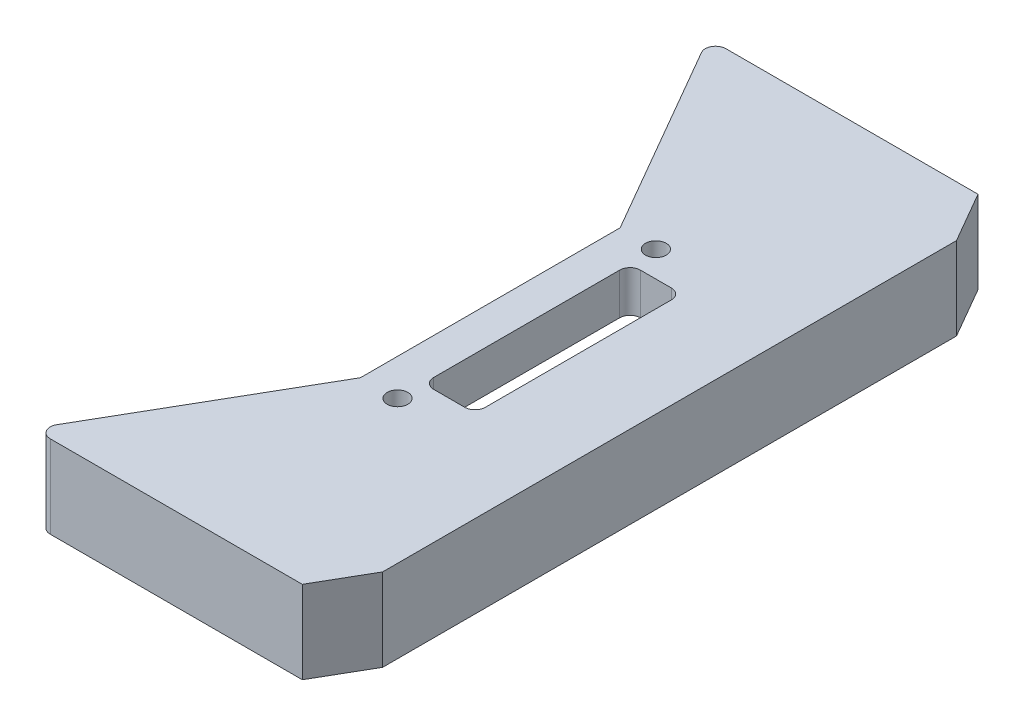
ISO-10303-21;
HEADER;
FILE_DESCRIPTION(('STEP AP214'),'2;1');
FILE_NAME('part.step','',(''),(''),'','','');
FILE_SCHEMA(('AUTOMOTIVE_DESIGN { 1 0 10303 214 1 1 1 1 }'));
ENDSEC;
DATA;
#1=APPLICATION_CONTEXT('core data for automotive mechanical design processes');
#2=APPLICATION_PROTOCOL_DEFINITION('international standard','automotive_design',2000,#1);
#3=PRODUCT_CONTEXT('',#1,'mechanical');
#4=PRODUCT('Part','Part','',(#3));
#5=PRODUCT_RELATED_PRODUCT_CATEGORY('part','',(#4));
#6=PRODUCT_DEFINITION_FORMATION('','',#4);
#7=PRODUCT_DEFINITION_CONTEXT('part definition',#1,'design');
#8=PRODUCT_DEFINITION('design','',#6,#7);
#9=PRODUCT_DEFINITION_SHAPE('','',#8);
#10=(LENGTH_UNIT() NAMED_UNIT(*) SI_UNIT(.MILLI.,.METRE.));
#11=(NAMED_UNIT(*) PLANE_ANGLE_UNIT() SI_UNIT($,.RADIAN.));
#12=(NAMED_UNIT(*) SI_UNIT($,.STERADIAN.) SOLID_ANGLE_UNIT());
#13=UNCERTAINTY_MEASURE_WITH_UNIT(LENGTH_MEASURE(1.E-05),#10,'distance_accuracy_value','');
#14=(GEOMETRIC_REPRESENTATION_CONTEXT(3) GLOBAL_UNCERTAINTY_ASSIGNED_CONTEXT((#13)) GLOBAL_UNIT_ASSIGNED_CONTEXT((#10,
#11,#12)) REPRESENTATION_CONTEXT('',''));
#15=CARTESIAN_POINT('',(0.,0.,0.));
#16=DIRECTION('',(0.,0.,1.));
#17=DIRECTION('',(1.,0.,0.));
#18=AXIS2_PLACEMENT_3D('',#15,#16,#17);
#19=CARTESIAN_POINT('',(0.,-9.,0.));
#20=DIRECTION('',(0.,1.,0.));
#21=DIRECTION('',(0.,0.,1.));
#22=AXIS2_PLACEMENT_3D('',#19,#20,#21);
#23=PLANE('',#22);
#24=DIRECTION('',(0.,0.,-1.));
#25=VECTOR('',#24,1.);
#26=CARTESIAN_POINT('',(77.3329037686546,-9.,38.));
#27=LINE('',#26,#25);
#28=CARTESIAN_POINT('',(77.3329037686546,-9.,37.));
#29=VERTEX_POINT('',#28);
#30=CARTESIAN_POINT('',(77.3329037686546,-9.,35.0669872981078));
#31=VERTEX_POINT('',#30);
#32=EDGE_CURVE('E313',#29,#31,#27,.T.);
#33=ORIENTED_EDGE('',*,*,#32,.F.);
#34=CARTESIAN_POINT('',(78.3329037686546,-9.,37.));
#35=DIRECTION('',(0.,1.,0.));
#36=DIRECTION('',(0.,0.,1.));
#37=AXIS2_PLACEMENT_3D('',#34,#35,#36);
#38=CIRCLE('',#37,1.);
#39=CARTESIAN_POINT('',(78.3329037686546,-9.,38.));
#40=VERTEX_POINT('',#39);
#41=EDGE_CURVE('E51',#29,#40,#38,.T.);
#42=ORIENTED_EDGE('',*,*,#41,.T.);
#43=DIRECTION('',(-1.,0.,0.));
#44=VECTOR('',#43,1.);
#45=CARTESIAN_POINT('',(77.3329037686546,-9.,38.));
#46=LINE('',#45,#44);
#47=CARTESIAN_POINT('',(86.8564064605509,-9.,38.));
#48=VERTEX_POINT('',#47);
#49=EDGE_CURVE('E303',#48,#40,#46,.T.);
#50=ORIENTED_EDGE('',*,*,#49,.F.);
#51=CARTESIAN_POINT('',(86.8564064605509,-9.,37.));
#52=DIRECTION('',(0.,1.,0.));
#53=DIRECTION('',(0.,0.,1.));
#54=AXIS2_PLACEMENT_3D('',#51,#52,#53);
#55=CIRCLE('',#54,1.);
#56=CARTESIAN_POINT('',(87.8564064605509,-9.,37.));
#57=VERTEX_POINT('',#56);
#58=EDGE_CURVE('E11',#48,#57,#55,.T.);
#59=ORIENTED_EDGE('',*,*,#58,.T.);
#60=DIRECTION('',(0.,0.,1.));
#61=VECTOR('',#60,1.);
#62=CARTESIAN_POINT('',(87.8564064605509,-9.,38.));
#63=LINE('',#62,#61);
#64=CARTESIAN_POINT('',(87.8564064605509,-9.,8.));
#65=VERTEX_POINT('',#64);
#66=EDGE_CURVE('E318',#65,#57,#63,.T.);
#67=ORIENTED_EDGE('',*,*,#66,.F.);
#68=CARTESIAN_POINT('',(86.8564064605509,-9.,8.));
#69=DIRECTION('',(0.,1.,0.));
#70=DIRECTION('',(0.,0.,1.));
#71=AXIS2_PLACEMENT_3D('',#68,#69,#70);
#72=CIRCLE('',#71,1.);
#73=CARTESIAN_POINT('',(86.8564064605509,-9.,7.));
#74=VERTEX_POINT('',#73);
#75=EDGE_CURVE('E510',#65,#74,#72,.T.);
#76=ORIENTED_EDGE('',*,*,#75,.T.);
#77=DIRECTION('',(1.,0.,0.));
#78=VECTOR('',#77,1.);
#79=CARTESIAN_POINT('',(77.3329037686546,-9.,7.));
#80=LINE('',#79,#78);
#81=CARTESIAN_POINT('',(78.3329037686546,-9.,7.));
#82=VERTEX_POINT('',#81);
#83=EDGE_CURVE('E315',#82,#74,#80,.T.);
#84=ORIENTED_EDGE('',*,*,#83,.F.);
#85=CARTESIAN_POINT('',(78.3329037686546,-9.,8.));
#86=DIRECTION('',(0.,1.,0.));
#87=DIRECTION('',(0.,0.,1.));
#88=AXIS2_PLACEMENT_3D('',#85,#86,#87);
#89=CIRCLE('',#88,1.);
#90=CARTESIAN_POINT('',(77.3329037686546,-9.,8.));
#91=VERTEX_POINT('',#90);
#92=EDGE_CURVE('E512',#82,#91,#89,.T.);
#93=ORIENTED_EDGE('',*,*,#92,.T.);
#94=CARTESIAN_POINT('',(77.3329037686546,-9.,9.93301270189214));
#95=VERTEX_POINT('',#94);
#96=EDGE_CURVE('E298',#95,#91,#27,.T.);
#97=ORIENTED_EDGE('',*,*,#96,.F.);
#98=DIRECTION('',(-0.5,0.,-0.866025403784439));
#99=VECTOR('',#98,1.);
#100=CARTESIAN_POINT('',(77.3329037686546,-9.,9.93301270189214));
#101=LINE('',#100,#99);
#102=CARTESIAN_POINT('',(66.8663373999927,-9.,-8.19561202942197));
#103=VERTEX_POINT('',#102);
#104=EDGE_CURVE('E410',#95,#103,#101,.T.);
#105=ORIENTED_EDGE('',*,*,#104,.T.);
#106=DIRECTION('',(-1.,0.,0.));
#107=VECTOR('',#106,1.);
#108=CARTESIAN_POINT('',(66.8663373999927,-9.,-8.19561202942197));
#109=LINE('',#108,#107);
#110=CARTESIAN_POINT('',(90.6820360040645,-9.,-8.19561202942197));
#111=VERTEX_POINT('',#110);
#112=EDGE_CURVE('E326',#111,#103,#109,.T.);
#113=ORIENTED_EDGE('',*,*,#112,.F.);
#114=DIRECTION('',(-0.499999999999996,0.,-0.866025403784441));
#115=VECTOR('',#114,1.);
#116=CARTESIAN_POINT('',(90.6820360040645,-9.,-8.19561202942197));
#117=LINE('',#116,#115);
#118=CARTESIAN_POINT('',(92.6817240078563,-9.,-4.73205080756865));
#119=VERTEX_POINT('',#118);
#120=EDGE_CURVE('E368',#119,#111,#117,.T.);
#121=ORIENTED_EDGE('',*,*,#120,.F.);
#122=DIRECTION('',(0.,0.,-1.));
#123=VECTOR('',#122,1.);
#124=CARTESIAN_POINT('',(92.6817240078563,-9.,-4.73205080756865));
#125=LINE('',#124,#123);
#126=CARTESIAN_POINT('',(92.6817240078563,-9.,49.7320508075686));
#127=VERTEX_POINT('',#126);
#128=EDGE_CURVE('E365',#127,#119,#125,.T.);
#129=ORIENTED_EDGE('',*,*,#128,.F.);
#130=DIRECTION('',(0.500000000000001,0.,-0.866025403784438));
#131=VECTOR('',#130,1.);
#132=CARTESIAN_POINT('',(92.6817240078563,-9.,49.7320508075686));
#133=LINE('',#132,#131);
#134=CARTESIAN_POINT('',(90.6820360040645,-9.,53.1956120294219));
#135=VERTEX_POINT('',#134);
#136=EDGE_CURVE('E362',#135,#127,#133,.T.);
#137=ORIENTED_EDGE('',*,*,#136,.F.);
#138=DIRECTION('',(1.,0.,0.));
#139=VECTOR('',#138,1.);
#140=CARTESIAN_POINT('',(90.6820360040645,-9.,53.1956120294219));
#141=LINE('',#140,#139);
#142=CARTESIAN_POINT('',(66.8663373999927,-9.,53.1956120294219));
#143=VERTEX_POINT('',#142);
#144=EDGE_CURVE('E312',#143,#135,#141,.T.);
#145=ORIENTED_EDGE('',*,*,#144,.F.);
#146=DIRECTION('',(0.5,0.,-0.866025403784439));
#147=VECTOR('',#146,1.);
#148=CARTESIAN_POINT('',(77.3329037686546,-9.,35.0669872981078));
#149=LINE('',#148,#147);
#150=EDGE_CURVE('E407',#143,#31,#149,.T.);
#151=ORIENTED_EDGE('',*,*,#150,.T.);
#152=EDGE_LOOP('',(#33,#42,#50,#59,#67,#76,#84,#93,#97,#105,#113,#121,#129,#137,#145,#151));
#153=FACE_BOUND('',#152,.T.);
#154=ADVANCED_FACE('F43',(#153),#23,.F.);
#155=CARTESIAN_POINT('',(0.,-7.,0.));
#156=DIRECTION('',(0.,1.,0.));
#157=DIRECTION('',(0.,0.,1.));
#158=AXIS2_PLACEMENT_3D('',#155,#156,#157);
#159=PLANE('',#158);
#160=CARTESIAN_POINT('',(80.8564064605509,-7.,10.));
#161=DIRECTION('',(0.,-1.,0.));
#162=DIRECTION('',(0.,0.,-1.));
#163=AXIS2_PLACEMENT_3D('',#160,#161,#162);
#164=CIRCLE('',#163,0.999999999999998);
#165=CARTESIAN_POINT('',(80.8564064605509,-7.,9.));
#166=VERTEX_POINT('',#165);
#167=EDGE_CURVE('E403',#166,#166,#164,.T.);
#168=ORIENTED_EDGE('',*,*,#167,.T.);
#169=EDGE_LOOP('',(#168));
#170=FACE_BOUND('',#169,.T.);
#171=DIRECTION('',(0.5,0.,-0.866025403784439));
#172=VECTOR('',#171,1.);
#173=CARTESIAN_POINT('',(77.3329037686546,-7.,35.0669872981078));
#174=LINE('',#173,#172);
#175=CARTESIAN_POINT('',(66.5776622653979,-7.,53.6956120294219));
#176=VERTEX_POINT('',#175);
#177=CARTESIAN_POINT('',(77.3329037686546,-7.,35.0669872981078));
#178=VERTEX_POINT('',#177);
#179=EDGE_CURVE('E423',#176,#178,#174,.T.);
#180=ORIENTED_EDGE('',*,*,#179,.F.);
#181=CARTESIAN_POINT('',(67.4436876691824,-7.,54.1956120294219));
#182=DIRECTION('',(0.,1.,0.));
#183=DIRECTION('',(0.,0.,1.));
#184=AXIS2_PLACEMENT_3D('',#181,#182,#183);
#185=CIRCLE('',#184,1.);
#186=CARTESIAN_POINT('',(67.4436876691824,-7.,55.1956120294219));
#187=VERTEX_POINT('',#186);
#188=EDGE_CURVE('E453',#176,#187,#185,.T.);
#189=ORIENTED_EDGE('',*,*,#188,.T.);
#190=DIRECTION('',(-1.,0.,0.));
#191=VECTOR('',#190,1.);
#192=CARTESIAN_POINT('',(65.7116368616135,-7.,55.1956120294219));
#193=LINE('',#192,#191);
#194=CARTESIAN_POINT('',(91.8367365424438,-7.,55.1956120294219));
#195=VERTEX_POINT('',#194);
#196=EDGE_CURVE('E420',#195,#187,#193,.T.);
#197=ORIENTED_EDGE('',*,*,#196,.F.);
#198=DIRECTION('',(-0.5,0.,0.866025403784439));
#199=VECTOR('',#198,1.);
#200=CARTESIAN_POINT('',(91.8367365424438,-7.,55.1956120294219));
#201=LINE('',#200,#199);
#202=CARTESIAN_POINT('',(94.6817240078563,-7.,50.2679491924309));
#203=VERTEX_POINT('',#202);
#204=EDGE_CURVE('E418',#203,#195,#201,.T.);
#205=ORIENTED_EDGE('',*,*,#204,.F.);
#206=DIRECTION('',(0.,0.,1.));
#207=VECTOR('',#206,1.);
#208=CARTESIAN_POINT('',(94.6817240078563,-7.,50.2679491924309));
#209=LINE('',#208,#207);
#210=CARTESIAN_POINT('',(94.6817240078563,-7.,-5.26794919243089));
#211=VERTEX_POINT('',#210);
#212=EDGE_CURVE('E416',#211,#203,#209,.T.);
#213=ORIENTED_EDGE('',*,*,#212,.F.);
#214=DIRECTION('',(0.499999999999997,0.,0.86602540378444));
#215=VECTOR('',#214,1.);
#216=CARTESIAN_POINT('',(91.8367365424438,-7.,-10.195612029422));
#217=LINE('',#216,#215);
#218=CARTESIAN_POINT('',(91.8367365424438,-7.,-10.195612029422));
#219=VERTEX_POINT('',#218);
#220=EDGE_CURVE('E406',#219,#211,#217,.T.);
#221=ORIENTED_EDGE('',*,*,#220,.F.);
#222=DIRECTION('',(1.,0.,0.));
#223=VECTOR('',#222,1.);
#224=CARTESIAN_POINT('',(65.7116368616135,-7.,-10.195612029422));
#225=LINE('',#224,#223);
#226=CARTESIAN_POINT('',(67.4436876691824,-7.,-10.195612029422));
#227=VERTEX_POINT('',#226);
#228=EDGE_CURVE('E411',#227,#219,#225,.T.);
#229=ORIENTED_EDGE('',*,*,#228,.F.);
#230=CARTESIAN_POINT('',(67.4436876691824,-7.,-9.19561202942197));
#231=DIRECTION('',(0.,1.,0.));
#232=DIRECTION('',(0.,0.,1.));
#233=AXIS2_PLACEMENT_3D('',#230,#231,#232);
#234=CIRCLE('',#233,1.);
#235=CARTESIAN_POINT('',(66.5776622653979,-7.,-8.69561202942197));
#236=VERTEX_POINT('',#235);
#237=EDGE_CURVE('E451',#227,#236,#234,.T.);
#238=ORIENTED_EDGE('',*,*,#237,.T.);
#239=DIRECTION('',(-0.5,0.,-0.866025403784439));
#240=VECTOR('',#239,1.);
#241=CARTESIAN_POINT('',(77.3329037686546,-7.,9.93301270189214));
#242=LINE('',#241,#240);
#243=CARTESIAN_POINT('',(77.3329037686546,-7.,9.93301270189214));
#244=VERTEX_POINT('',#243);
#245=EDGE_CURVE('E427',#244,#236,#242,.T.);
#246=ORIENTED_EDGE('',*,*,#245,.F.);
#247=DIRECTION('',(0.,0.,-1.));
#248=VECTOR('',#247,1.);
#249=CARTESIAN_POINT('',(77.3329037686546,-7.,35.0669872981078));
#250=LINE('',#249,#248);
#251=EDGE_CURVE('E425',#178,#244,#250,.T.);
#252=ORIENTED_EDGE('',*,*,#251,.F.);
#253=EDGE_LOOP('',(#180,#189,#197,#205,#213,#221,#229,#238,#246,#252));
#254=FACE_BOUND('',#253,.T.);
#255=CARTESIAN_POINT('',(80.8564064605509,-7.,35.));
#256=DIRECTION('',(0.,-1.,0.));
#257=DIRECTION('',(0.,0.,-1.));
#258=AXIS2_PLACEMENT_3D('',#255,#256,#257);
#259=CIRCLE('',#258,0.999999999999998);
#260=CARTESIAN_POINT('',(80.8564064605509,-7.,34.));
#261=VERTEX_POINT('',#260);
#262=EDGE_CURVE('E400',#261,#261,#259,.T.);
#263=ORIENTED_EDGE('',*,*,#262,.T.);
#264=EDGE_LOOP('',(#263));
#265=FACE_BOUND('',#264,.T.);
#266=DIRECTION('',(0.,0.,1.));
#267=VECTOR('',#266,1.);
#268=CARTESIAN_POINT('',(85.8564064605509,-7.,32.5));
#269=LINE('',#268,#267);
#270=CARTESIAN_POINT('',(85.8564064605509,-7.,13.5));
#271=VERTEX_POINT('',#270);
#272=CARTESIAN_POINT('',(85.8564064605509,-7.,31.5));
#273=VERTEX_POINT('',#272);
#274=EDGE_CURVE('E394',#271,#273,#269,.T.);
#275=ORIENTED_EDGE('',*,*,#274,.T.);
#276=CARTESIAN_POINT('',(84.8564064605509,-7.,31.5));
#277=DIRECTION('',(0.,1.,0.));
#278=DIRECTION('',(0.,0.,1.));
#279=AXIS2_PLACEMENT_3D('',#276,#277,#278);
#280=CIRCLE('',#279,1.);
#281=CARTESIAN_POINT('',(84.8564064605509,-7.,32.5));
#282=VERTEX_POINT('',#281);
#283=EDGE_CURVE('E262',#273,#282,#280,.F.);
#284=ORIENTED_EDGE('',*,*,#283,.T.);
#285=DIRECTION('',(-1.,0.,0.));
#286=VECTOR('',#285,1.);
#287=CARTESIAN_POINT('',(80.8564064605509,-7.,32.5));
#288=LINE('',#287,#286);
#289=CARTESIAN_POINT('',(81.8564064605509,-7.,32.5));
#290=VERTEX_POINT('',#289);
#291=EDGE_CURVE('E397',#282,#290,#288,.T.);
#292=ORIENTED_EDGE('',*,*,#291,.T.);
#293=CARTESIAN_POINT('',(81.8564064605509,-7.,31.5));
#294=DIRECTION('',(0.,1.,0.));
#295=DIRECTION('',(0.,0.,1.));
#296=AXIS2_PLACEMENT_3D('',#293,#294,#295);
#297=CIRCLE('',#296,1.);
#298=CARTESIAN_POINT('',(80.8564064605509,-7.,31.5));
#299=VERTEX_POINT('',#298);
#300=EDGE_CURVE('E479',#290,#299,#297,.F.);
#301=ORIENTED_EDGE('',*,*,#300,.T.);
#302=DIRECTION('',(0.,0.,-1.));
#303=VECTOR('',#302,1.);
#304=CARTESIAN_POINT('',(80.8564064605509,-7.,32.5));
#305=LINE('',#304,#303);
#306=CARTESIAN_POINT('',(80.8564064605509,-7.,13.5));
#307=VERTEX_POINT('',#306);
#308=EDGE_CURVE('E260',#299,#307,#305,.T.);
#309=ORIENTED_EDGE('',*,*,#308,.T.);
#310=CARTESIAN_POINT('',(81.8564064605509,-7.,13.5));
#311=DIRECTION('',(0.,1.,0.));
#312=DIRECTION('',(0.,0.,1.));
#313=AXIS2_PLACEMENT_3D('',#310,#311,#312);
#314=CIRCLE('',#313,1.);
#315=CARTESIAN_POINT('',(81.8564064605509,-7.,12.5));
#316=VERTEX_POINT('',#315);
#317=EDGE_CURVE('E481',#307,#316,#314,.F.);
#318=ORIENTED_EDGE('',*,*,#317,.T.);
#319=DIRECTION('',(1.,0.,0.));
#320=VECTOR('',#319,1.);
#321=CARTESIAN_POINT('',(80.8564064605509,-7.,12.5));
#322=LINE('',#321,#320);
#323=CARTESIAN_POINT('',(84.8564064605509,-7.,12.5));
#324=VERTEX_POINT('',#323);
#325=EDGE_CURVE('E391',#316,#324,#322,.T.);
#326=ORIENTED_EDGE('',*,*,#325,.T.);
#327=CARTESIAN_POINT('',(84.8564064605509,-7.,13.5));
#328=DIRECTION('',(0.,1.,0.));
#329=DIRECTION('',(0.,0.,1.));
#330=AXIS2_PLACEMENT_3D('',#327,#328,#329);
#331=CIRCLE('',#330,1.);
#332=EDGE_CURVE('E477',#324,#271,#331,.F.);
#333=ORIENTED_EDGE('',*,*,#332,.T.);
#334=EDGE_LOOP('',(#275,#284,#292,#301,#309,#318,#326,#333));
#335=FACE_BOUND('',#334,.T.);
#336=ADVANCED_FACE('F556',(#170,#254,#265,#335),#159,.T.);
#337=CARTESIAN_POINT('',(91.8367365424438,-9.,-10.195612029422));
#338=DIRECTION('',(-0.86602540378444,0.,0.499999999999997));
#339=DIRECTION('',(0.499999999999997,0.,0.86602540378444));
#340=AXIS2_PLACEMENT_3D('',#337,#338,#339);
#341=PLANE('',#340);
#342=ORIENTED_EDGE('',*,*,#220,.T.);
#343=DIRECTION('',(0.,1.,0.));
#344=VECTOR('',#343,1.);
#345=CARTESIAN_POINT('',(94.6817240078563,-9.,-5.26794919243089));
#346=LINE('',#345,#344);
#347=CARTESIAN_POINT('',(94.6817240078563,-15.,-5.26794919243089));
#348=VERTEX_POINT('',#347);
#349=EDGE_CURVE('E445',#348,#211,#346,.T.);
#350=ORIENTED_EDGE('',*,*,#349,.F.);
#351=DIRECTION('',(0.499999999999997,0.,0.86602540378444));
#352=VECTOR('',#351,1.);
#353=CARTESIAN_POINT('',(91.8367365424438,-15.,-10.195612029422));
#354=LINE('',#353,#352);
#355=CARTESIAN_POINT('',(91.8367365424438,-15.,-10.195612029422));
#356=VERTEX_POINT('',#355);
#357=EDGE_CURVE('E353',#356,#348,#354,.T.);
#358=ORIENTED_EDGE('',*,*,#357,.F.);
#359=DIRECTION('',(0.,1.,0.));
#360=VECTOR('',#359,1.);
#361=CARTESIAN_POINT('',(91.8367365424438,-9.,-10.195612029422));
#362=LINE('',#361,#360);
#363=EDGE_CURVE('E413',#356,#219,#362,.T.);
#364=ORIENTED_EDGE('',*,*,#363,.T.);
#365=EDGE_LOOP('',(#342,#350,#358,#364));
#366=FACE_BOUND('',#365,.T.);
#367=ADVANCED_FACE('F574',(#366),#341,.F.);
#368=CARTESIAN_POINT('',(94.6817240078563,-9.,50.2679491924309));
#369=DIRECTION('',(-1.,0.,0.));
#370=DIRECTION('',(0.,0.,1.));
#371=AXIS2_PLACEMENT_3D('',#368,#369,#370);
#372=PLANE('',#371);
#373=ORIENTED_EDGE('',*,*,#212,.T.);
#374=DIRECTION('',(0.,1.,0.));
#375=VECTOR('',#374,1.);
#376=CARTESIAN_POINT('',(94.6817240078563,-9.,50.2679491924309));
#377=LINE('',#376,#375);
#378=CARTESIAN_POINT('',(94.6817240078563,-15.,50.2679491924309));
#379=VERTEX_POINT('',#378);
#380=EDGE_CURVE('E442',#379,#203,#377,.T.);
#381=ORIENTED_EDGE('',*,*,#380,.F.);
#382=DIRECTION('',(0.,0.,1.));
#383=VECTOR('',#382,1.);
#384=CARTESIAN_POINT('',(94.6817240078563,-15.,-5.26794919243089));
#385=LINE('',#384,#383);
#386=EDGE_CURVE('E356',#348,#379,#385,.T.);
#387=ORIENTED_EDGE('',*,*,#386,.F.);
#388=ORIENTED_EDGE('',*,*,#349,.T.);
#389=EDGE_LOOP('',(#373,#381,#387,#388));
#390=FACE_BOUND('',#389,.T.);
#391=ADVANCED_FACE('F579',(#390),#372,.F.);
#392=CARTESIAN_POINT('',(91.8367365424438,-9.,55.1956120294219));
#393=DIRECTION('',(-0.866025403784439,0.,-0.5));
#394=DIRECTION('',(-0.5,0.,0.866025403784439));
#395=AXIS2_PLACEMENT_3D('',#392,#393,#394);
#396=PLANE('',#395);
#397=ORIENTED_EDGE('',*,*,#204,.T.);
#398=DIRECTION('',(0.,1.,0.));
#399=VECTOR('',#398,1.);
#400=CARTESIAN_POINT('',(91.8367365424438,-9.,55.1956120294219));
#401=LINE('',#400,#399);
#402=CARTESIAN_POINT('',(91.8367365424438,-15.,55.1956120294219));
#403=VERTEX_POINT('',#402);
#404=EDGE_CURVE('E439',#403,#195,#401,.T.);
#405=ORIENTED_EDGE('',*,*,#404,.F.);
#406=DIRECTION('',(-0.5,0.,0.866025403784439));
#407=VECTOR('',#406,1.);
#408=CARTESIAN_POINT('',(94.6817240078563,-15.,50.2679491924309));
#409=LINE('',#408,#407);
#410=EDGE_CURVE('E322',#379,#403,#409,.T.);
#411=ORIENTED_EDGE('',*,*,#410,.F.);
#412=ORIENTED_EDGE('',*,*,#380,.T.);
#413=EDGE_LOOP('',(#397,#405,#411,#412));
#414=FACE_BOUND('',#413,.T.);
#415=ADVANCED_FACE('F582',(#414),#396,.F.);
#416=CARTESIAN_POINT('',(65.7116368616135,-9.,55.1956120294219));
#417=DIRECTION('',(0.,0.,-1.));
#418=DIRECTION('',(-1.,0.,0.));
#419=AXIS2_PLACEMENT_3D('',#416,#417,#418);
#420=PLANE('',#419);
#421=ORIENTED_EDGE('',*,*,#196,.T.);
#422=DIRECTION('',(0.,1.,0.));
#423=VECTOR('',#422,1.);
#424=CARTESIAN_POINT('',(67.4436876691824,-9.,55.1956120294219));
#425=LINE('',#424,#423);
#426=CARTESIAN_POINT('',(67.4436876691824,-15.,55.1956120294219));
#427=VERTEX_POINT('',#426);
#428=EDGE_CURVE('E455',#187,#427,#425,.F.);
#429=ORIENTED_EDGE('',*,*,#428,.T.);
#430=DIRECTION('',(-1.,0.,0.));
#431=VECTOR('',#430,1.);
#432=CARTESIAN_POINT('',(91.8367365424438,-15.,55.1956120294219));
#433=LINE('',#432,#431);
#434=EDGE_CURVE('E325',#403,#427,#433,.T.);
#435=ORIENTED_EDGE('',*,*,#434,.F.);
#436=ORIENTED_EDGE('',*,*,#404,.T.);
#437=EDGE_LOOP('',(#421,#429,#435,#436));
#438=FACE_BOUND('',#437,.T.);
#439=ADVANCED_FACE('F585',(#438),#420,.F.);
#440=CARTESIAN_POINT('',(77.3329037686546,-9.,35.0669872981078));
#441=DIRECTION('',(0.866025403784439,0.,0.5));
#442=DIRECTION('',(0.5,0.,-0.866025403784439));
#443=AXIS2_PLACEMENT_3D('',#440,#441,#442);
#444=PLANE('',#443);
#445=ORIENTED_EDGE('',*,*,#150,.F.);
#446=DIRECTION('',(0.,1.,0.));
#447=VECTOR('',#446,1.);
#448=CARTESIAN_POINT('',(66.8663373999927,-15.,53.1956120294219));
#449=LINE('',#448,#447);
#450=CARTESIAN_POINT('',(66.8663373999927,-15.,53.1956120294219));
#451=VERTEX_POINT('',#450);
#452=EDGE_CURVE('E387',#451,#143,#449,.T.);
#453=ORIENTED_EDGE('',*,*,#452,.F.);
#454=DIRECTION('',(0.499999999999996,0.,-0.866025403784441));
#455=VECTOR('',#454,1.);
#456=CARTESIAN_POINT('',(66.5776622653979,-15.,53.6956120294219));
#457=LINE('',#456,#455);
#458=CARTESIAN_POINT('',(66.5776622653979,-15.,53.6956120294219));
#459=VERTEX_POINT('',#458);
#460=EDGE_CURVE('E332',#459,#451,#457,.T.);
#461=ORIENTED_EDGE('',*,*,#460,.F.);
#462=DIRECTION('',(0.,1.,0.));
#463=VECTOR('',#462,1.);
#464=CARTESIAN_POINT('',(66.5776622653979,-9.,53.6956120294219));
#465=LINE('',#464,#463);
#466=EDGE_CURVE('E448',#459,#176,#465,.T.);
#467=ORIENTED_EDGE('',*,*,#466,.T.);
#468=ORIENTED_EDGE('',*,*,#179,.T.);
#469=DIRECTION('',(0.,1.,0.));
#470=VECTOR('',#469,1.);
#471=CARTESIAN_POINT('',(77.3329037686546,-9.,35.0669872981078));
#472=LINE('',#471,#470);
#473=EDGE_CURVE('E436',#31,#178,#472,.T.);
#474=ORIENTED_EDGE('',*,*,#473,.F.);
#475=EDGE_LOOP('',(#445,#453,#461,#467,#468,#474));
#476=FACE_BOUND('',#475,.T.);
#477=ADVANCED_FACE('F551',(#476),#444,.F.);
#478=CARTESIAN_POINT('',(77.3329037686546,-9.,35.0669872981078));
#479=DIRECTION('',(1.,0.,0.));
#480=DIRECTION('',(0.,0.,-1.));
#481=AXIS2_PLACEMENT_3D('',#478,#479,#480);
#482=PLANE('',#481);
#483=ORIENTED_EDGE('',*,*,#96,.T.);
#484=DIRECTION('',(0.,1.,0.));
#485=VECTOR('',#484,1.);
#486=CARTESIAN_POINT('',(77.3329037686546,-9.,8.));
#487=LINE('',#486,#485);
#488=CARTESIAN_POINT('',(77.3329037686546,-11.,8.));
#489=VERTEX_POINT('',#488);
#490=EDGE_CURVE('E504',#91,#489,#487,.F.);
#491=ORIENTED_EDGE('',*,*,#490,.T.);
#492=DIRECTION('',(0.,0.,-1.));
#493=VECTOR('',#492,1.);
#494=CARTESIAN_POINT('',(77.3329037686546,-11.,38.));
#495=LINE('',#494,#493);
#496=CARTESIAN_POINT('',(77.3329037686546,-11.,37.));
#497=VERTEX_POINT('',#496);
#498=EDGE_CURVE('E299',#497,#489,#495,.T.);
#499=ORIENTED_EDGE('',*,*,#498,.F.);
#500=DIRECTION('',(0.,1.,0.));
#501=VECTOR('',#500,1.);
#502=CARTESIAN_POINT('',(77.3329037686546,-9.,37.));
#503=LINE('',#502,#501);
#504=EDGE_CURVE('E501',#497,#29,#503,.T.);
#505=ORIENTED_EDGE('',*,*,#504,.T.);
#506=ORIENTED_EDGE('',*,*,#32,.T.);
#507=ORIENTED_EDGE('',*,*,#473,.T.);
#508=ORIENTED_EDGE('',*,*,#251,.T.);
#509=DIRECTION('',(0.,1.,0.));
#510=VECTOR('',#509,1.);
#511=CARTESIAN_POINT('',(77.3329037686546,-9.,9.93301270189214));
#512=LINE('',#511,#510);
#513=EDGE_CURVE('E433',#95,#244,#512,.T.);
#514=ORIENTED_EDGE('',*,*,#513,.F.);
#515=EDGE_LOOP('',(#483,#491,#499,#505,#506,#507,#508,#514));
#516=FACE_BOUND('',#515,.T.);
#517=ADVANCED_FACE('F521',(#516),#482,.F.);
#518=CARTESIAN_POINT('',(77.3329037686546,-9.,9.93301270189214));
#519=DIRECTION('',(0.866025403784439,0.,-0.5));
#520=DIRECTION('',(-0.5,0.,-0.866025403784439));
#521=AXIS2_PLACEMENT_3D('',#518,#519,#520);
#522=PLANE('',#521);
#523=ORIENTED_EDGE('',*,*,#245,.T.);
#524=DIRECTION('',(0.,1.,0.));
#525=VECTOR('',#524,1.);
#526=CARTESIAN_POINT('',(66.5776622653979,-9.,-8.69561202942197));
#527=LINE('',#526,#525);
#528=CARTESIAN_POINT('',(66.5776622653979,-15.,-8.69561202942197));
#529=VERTEX_POINT('',#528);
#530=EDGE_CURVE('E460',#236,#529,#527,.F.);
#531=ORIENTED_EDGE('',*,*,#530,.T.);
#532=DIRECTION('',(-0.500000000000015,0.,-0.86602540378443));
#533=VECTOR('',#532,1.);
#534=CARTESIAN_POINT('',(66.8663373999927,-15.,-8.19561202942197));
#535=LINE('',#534,#533);
#536=CARTESIAN_POINT('',(66.8663373999927,-15.,-8.19561202942197));
#537=VERTEX_POINT('',#536);
#538=EDGE_CURVE('E344',#537,#529,#535,.T.);
#539=ORIENTED_EDGE('',*,*,#538,.F.);
#540=DIRECTION('',(0.,1.,0.));
#541=VECTOR('',#540,1.);
#542=CARTESIAN_POINT('',(66.8663373999927,-15.,-8.19561202942197));
#543=LINE('',#542,#541);
#544=EDGE_CURVE('E359',#537,#103,#543,.T.);
#545=ORIENTED_EDGE('',*,*,#544,.T.);
#546=ORIENTED_EDGE('',*,*,#104,.F.);
#547=ORIENTED_EDGE('',*,*,#513,.T.);
#548=EDGE_LOOP('',(#523,#531,#539,#545,#546,#547));
#549=FACE_BOUND('',#548,.T.);
#550=ADVANCED_FACE('F561',(#549),#522,.F.);
#551=CARTESIAN_POINT('',(65.7116368616135,-9.,-10.195612029422));
#552=DIRECTION('',(0.,0.,1.));
#553=DIRECTION('',(1.,0.,0.));
#554=AXIS2_PLACEMENT_3D('',#551,#552,#553);
#555=PLANE('',#554);
#556=ORIENTED_EDGE('',*,*,#363,.F.);
#557=DIRECTION('',(1.,0.,0.));
#558=VECTOR('',#557,1.);
#559=CARTESIAN_POINT('',(67.4436876691824,-15.,-10.195612029422));
#560=LINE('',#559,#558);
#561=CARTESIAN_POINT('',(67.4436876691824,-15.,-10.195612029422));
#562=VERTEX_POINT('',#561);
#563=EDGE_CURVE('E350',#562,#356,#560,.T.);
#564=ORIENTED_EDGE('',*,*,#563,.F.);
#565=DIRECTION('',(0.,1.,0.));
#566=VECTOR('',#565,1.);
#567=CARTESIAN_POINT('',(67.4436876691824,-9.,-10.195612029422));
#568=LINE('',#567,#566);
#569=EDGE_CURVE('E457',#562,#227,#568,.T.);
#570=ORIENTED_EDGE('',*,*,#569,.T.);
#571=ORIENTED_EDGE('',*,*,#228,.T.);
#572=EDGE_LOOP('',(#556,#564,#570,#571));
#573=FACE_BOUND('',#572,.T.);
#574=ADVANCED_FACE('F571',(#573),#555,.F.);
#575=CARTESIAN_POINT('',(80.8564064605509,-9.,10.));
#576=DIRECTION('',(0.,1.,0.));
#577=DIRECTION('',(0.,0.,1.));
#578=AXIS2_PLACEMENT_3D('',#575,#576,#577);
#579=CYLINDRICAL_SURFACE('',#578,0.999999999999998);
#580=ORIENTED_EDGE('',*,*,#167,.F.);
#581=EDGE_LOOP('',(#580));
#582=FACE_BOUND('',#581,.T.);
#583=CARTESIAN_POINT('',(80.8564064605509,-11.,10.));
#584=DIRECTION('',(0.,-1.,0.));
#585=DIRECTION('',(0.,0.,-1.));
#586=AXIS2_PLACEMENT_3D('',#583,#584,#585);
#587=CIRCLE('',#586,0.999999999999997);
#588=CARTESIAN_POINT('',(80.8564064605509,-11.,9.));
#589=VERTEX_POINT('',#588);
#590=EDGE_CURVE('E971',#589,#589,#587,.T.);
#591=ORIENTED_EDGE('',*,*,#590,.T.);
#592=EDGE_LOOP('',(#591));
#593=FACE_BOUND('',#592,.T.);
#594=ADVANCED_FACE('F629',(#582,#593),#579,.F.);
#595=CARTESIAN_POINT('',(80.8564064605509,-9.,35.));
#596=DIRECTION('',(0.,1.,0.));
#597=DIRECTION('',(0.,0.,1.));
#598=AXIS2_PLACEMENT_3D('',#595,#596,#597);
#599=CYLINDRICAL_SURFACE('',#598,0.999999999999998);
#600=ORIENTED_EDGE('',*,*,#262,.F.);
#601=EDGE_LOOP('',(#600));
#602=FACE_BOUND('',#601,.T.);
#603=CARTESIAN_POINT('',(80.8564064605509,-11.,35.));
#604=DIRECTION('',(0.,-1.,0.));
#605=DIRECTION('',(0.,0.,-1.));
#606=AXIS2_PLACEMENT_3D('',#603,#604,#605);
#607=CIRCLE('',#606,1.);
#608=CARTESIAN_POINT('',(80.8564064605509,-11.,34.));
#609=VERTEX_POINT('',#608);
#610=EDGE_CURVE('E273',#609,#609,#607,.T.);
#611=ORIENTED_EDGE('',*,*,#610,.T.);
#612=EDGE_LOOP('',(#611));
#613=FACE_BOUND('',#612,.T.);
#614=ADVANCED_FACE('F755',(#602,#613),#599,.F.);
#615=CARTESIAN_POINT('',(80.8564064605509,-9.,32.5));
#616=DIRECTION('',(1.,0.,0.));
#617=DIRECTION('',(0.,0.,-1.));
#618=AXIS2_PLACEMENT_3D('',#615,#616,#617);
#619=PLANE('',#618);
#620=ORIENTED_EDGE('',*,*,#308,.F.);
#621=DIRECTION('',(0.,1.,0.));
#622=VECTOR('',#621,1.);
#623=CARTESIAN_POINT('',(80.8564064605509,-9.,31.5));
#624=LINE('',#623,#622);
#625=CARTESIAN_POINT('',(80.8564064605509,-11.,31.5));
#626=VERTEX_POINT('',#625);
#627=EDGE_CURVE('E252',#299,#626,#624,.F.);
#628=ORIENTED_EDGE('',*,*,#627,.T.);
#629=DIRECTION('',(0.,0.,-1.));
#630=VECTOR('',#629,1.);
#631=CARTESIAN_POINT('',(80.8564064605509,-11.,31.5));
#632=LINE('',#631,#630);
#633=CARTESIAN_POINT('',(80.8564064605509,-11.,13.5));
#634=VERTEX_POINT('',#633);
#635=EDGE_CURVE('E257',#626,#634,#632,.T.);
#636=ORIENTED_EDGE('',*,*,#635,.T.);
#637=DIRECTION('',(0.,1.,0.));
#638=VECTOR('',#637,1.);
#639=CARTESIAN_POINT('',(80.8564064605509,-7.,13.5));
#640=LINE('',#639,#638);
#641=EDGE_CURVE('E263',#634,#307,#640,.T.);
#642=ORIENTED_EDGE('',*,*,#641,.T.);
#643=EDGE_LOOP('',(#620,#628,#636,#642));
#644=FACE_BOUND('',#643,.T.);
#645=ADVANCED_FACE('F254',(#644),#619,.T.);
#646=CARTESIAN_POINT('',(80.8564064605509,-9.,12.5));
#647=DIRECTION('',(0.,0.,1.));
#648=DIRECTION('',(1.,0.,0.));
#649=AXIS2_PLACEMENT_3D('',#646,#647,#648);
#650=PLANE('',#649);
#651=DIRECTION('',(0.,1.,0.));
#652=VECTOR('',#651,1.);
#653=CARTESIAN_POINT('',(81.8564064605509,-9.,12.5));
#654=LINE('',#653,#652);
#655=CARTESIAN_POINT('',(81.8564064605509,-11.,12.5));
#656=VERTEX_POINT('',#655);
#657=EDGE_CURVE('E470',#316,#656,#654,.F.);
#658=ORIENTED_EDGE('',*,*,#657,.T.);
#659=DIRECTION('',(1.,0.,0.));
#660=VECTOR('',#659,1.);
#661=CARTESIAN_POINT('',(81.8564064605509,-11.,12.5));
#662=LINE('',#661,#660);
#663=CARTESIAN_POINT('',(84.8564064605509,-11.,12.5));
#664=VERTEX_POINT('',#663);
#665=EDGE_CURVE('E281',#656,#664,#662,.T.);
#666=ORIENTED_EDGE('',*,*,#665,.T.);
#667=DIRECTION('',(0.,1.,0.));
#668=VECTOR('',#667,1.);
#669=CARTESIAN_POINT('',(84.8564064605509,-7.,12.5));
#670=LINE('',#669,#668);
#671=EDGE_CURVE('E472',#664,#324,#670,.T.);
#672=ORIENTED_EDGE('',*,*,#671,.T.);
#673=ORIENTED_EDGE('',*,*,#325,.F.);
#674=EDGE_LOOP('',(#658,#666,#672,#673));
#675=FACE_BOUND('',#674,.T.);
#676=ADVANCED_FACE('F734',(#675),#650,.T.);
#677=CARTESIAN_POINT('',(85.8564064605509,-9.,32.5));
#678=DIRECTION('',(-1.,0.,0.));
#679=DIRECTION('',(0.,0.,1.));
#680=AXIS2_PLACEMENT_3D('',#677,#678,#679);
#681=PLANE('',#680);
#682=DIRECTION('',(0.,1.,0.));
#683=VECTOR('',#682,1.);
#684=CARTESIAN_POINT('',(85.8564064605509,-9.,13.5));
#685=LINE('',#684,#683);
#686=CARTESIAN_POINT('',(85.8564064605509,-11.,13.5));
#687=VERTEX_POINT('',#686);
#688=EDGE_CURVE('E462',#271,#687,#685,.F.);
#689=ORIENTED_EDGE('',*,*,#688,.T.);
#690=DIRECTION('',(0.,0.,1.));
#691=VECTOR('',#690,1.);
#692=CARTESIAN_POINT('',(85.8564064605509,-11.,13.5));
#693=LINE('',#692,#691);
#694=CARTESIAN_POINT('',(85.8564064605509,-11.,31.5));
#695=VERTEX_POINT('',#694);
#696=EDGE_CURVE('E290',#687,#695,#693,.T.);
#697=ORIENTED_EDGE('',*,*,#696,.T.);
#698=DIRECTION('',(0.,1.,0.));
#699=VECTOR('',#698,1.);
#700=CARTESIAN_POINT('',(85.8564064605509,-7.,31.5));
#701=LINE('',#700,#699);
#702=EDGE_CURVE('E464',#695,#273,#701,.T.);
#703=ORIENTED_EDGE('',*,*,#702,.T.);
#704=ORIENTED_EDGE('',*,*,#274,.F.);
#705=EDGE_LOOP('',(#689,#697,#703,#704));
#706=FACE_BOUND('',#705,.T.);
#707=ADVANCED_FACE('F723',(#706),#681,.T.);
#708=CARTESIAN_POINT('',(80.8564064605509,-9.,32.5));
#709=DIRECTION('',(0.,0.,-1.));
#710=DIRECTION('',(-1.,0.,0.));
#711=AXIS2_PLACEMENT_3D('',#708,#709,#710);
#712=PLANE('',#711);
#713=ORIENTED_EDGE('',*,*,#291,.F.);
#714=DIRECTION('',(0.,1.,0.));
#715=VECTOR('',#714,1.);
#716=CARTESIAN_POINT('',(84.8564064605509,-9.,32.5));
#717=LINE('',#716,#715);
#718=CARTESIAN_POINT('',(84.8564064605509,-11.,32.5));
#719=VERTEX_POINT('',#718);
#720=EDGE_CURVE('E468',#282,#719,#717,.F.);
#721=ORIENTED_EDGE('',*,*,#720,.T.);
#722=DIRECTION('',(-1.,0.,0.));
#723=VECTOR('',#722,1.);
#724=CARTESIAN_POINT('',(84.8564064605509,-11.,32.5));
#725=LINE('',#724,#723);
#726=CARTESIAN_POINT('',(81.8564064605509,-11.,32.5));
#727=VERTEX_POINT('',#726);
#728=EDGE_CURVE('E296',#719,#727,#725,.T.);
#729=ORIENTED_EDGE('',*,*,#728,.T.);
#730=DIRECTION('',(0.,1.,0.));
#731=VECTOR('',#730,1.);
#732=CARTESIAN_POINT('',(81.8564064605509,-7.,32.5));
#733=LINE('',#732,#731);
#734=EDGE_CURVE('E269',#727,#290,#733,.T.);
#735=ORIENTED_EDGE('',*,*,#734,.T.);
#736=EDGE_LOOP('',(#713,#721,#729,#735));
#737=FACE_BOUND('',#736,.T.);
#738=ADVANCED_FACE('F650',(#737),#712,.T.);
#739=CARTESIAN_POINT('',(67.4436876691824,-9.,54.1956120294219));
#740=DIRECTION('',(0.,1.,0.));
#741=DIRECTION('',(0.,0.,1.));
#742=AXIS2_PLACEMENT_3D('',#739,#740,#741);
#743=CYLINDRICAL_SURFACE('',#742,1.);
#744=ORIENTED_EDGE('',*,*,#466,.F.);
#745=CARTESIAN_POINT('',(67.4436876691824,-15.,54.1956120294219));
#746=DIRECTION('',(0.,-1.,0.));
#747=DIRECTION('',(0.,0.,-1.));
#748=AXIS2_PLACEMENT_3D('',#745,#746,#747);
#749=CIRCLE('',#748,1.);
#750=EDGE_CURVE('E329',#427,#459,#749,.T.);
#751=ORIENTED_EDGE('',*,*,#750,.F.);
#752=ORIENTED_EDGE('',*,*,#428,.F.);
#753=ORIENTED_EDGE('',*,*,#188,.F.);
#754=EDGE_LOOP('',(#744,#751,#752,#753));
#755=FACE_BOUND('',#754,.T.);
#756=ADVANCED_FACE('F590',(#755),#743,.T.);
#757=CARTESIAN_POINT('',(67.4436876691824,-9.,-9.19561202942197));
#758=DIRECTION('',(0.,1.,0.));
#759=DIRECTION('',(0.,0.,1.));
#760=AXIS2_PLACEMENT_3D('',#757,#758,#759);
#761=CYLINDRICAL_SURFACE('',#760,1.);
#762=ORIENTED_EDGE('',*,*,#569,.F.);
#763=CARTESIAN_POINT('',(67.4436876691824,-15.,-9.19561202942197));
#764=DIRECTION('',(0.,-1.,0.));
#765=DIRECTION('',(0.,0.,-1.));
#766=AXIS2_PLACEMENT_3D('',#763,#764,#765);
#767=CIRCLE('',#766,1.);
#768=EDGE_CURVE('E347',#529,#562,#767,.T.);
#769=ORIENTED_EDGE('',*,*,#768,.F.);
#770=ORIENTED_EDGE('',*,*,#530,.F.);
#771=ORIENTED_EDGE('',*,*,#237,.F.);
#772=EDGE_LOOP('',(#762,#769,#770,#771));
#773=FACE_BOUND('',#772,.T.);
#774=ADVANCED_FACE('F565',(#773),#761,.T.);
#775=CARTESIAN_POINT('',(84.8564064605509,-9.,31.5));
#776=DIRECTION('',(0.,-1.,0.));
#777=DIRECTION('',(0.,0.,-1.));
#778=AXIS2_PLACEMENT_3D('',#775,#776,#777);
#779=CYLINDRICAL_SURFACE('',#778,1.);
#780=ORIENTED_EDGE('',*,*,#702,.F.);
#781=CARTESIAN_POINT('',(84.8564064605509,-11.,31.5));
#782=DIRECTION('',(0.,-1.,0.));
#783=DIRECTION('',(0.,0.,-1.));
#784=AXIS2_PLACEMENT_3D('',#781,#782,#783);
#785=CIRCLE('',#784,1.);
#786=EDGE_CURVE('E293',#695,#719,#785,.T.);
#787=ORIENTED_EDGE('',*,*,#786,.T.);
#788=ORIENTED_EDGE('',*,*,#720,.F.);
#789=ORIENTED_EDGE('',*,*,#283,.F.);
#790=EDGE_LOOP('',(#780,#787,#788,#789));
#791=FACE_BOUND('',#790,.T.);
#792=ADVANCED_FACE('F653',(#791),#779,.F.);
#793=CARTESIAN_POINT('',(84.8564064605509,-9.,13.5));
#794=DIRECTION('',(0.,-1.,0.));
#795=DIRECTION('',(0.,0.,-1.));
#796=AXIS2_PLACEMENT_3D('',#793,#794,#795);
#797=CYLINDRICAL_SURFACE('',#796,1.);
#798=ORIENTED_EDGE('',*,*,#671,.F.);
#799=CARTESIAN_POINT('',(84.8564064605509,-11.,13.5));
#800=DIRECTION('',(0.,-1.,0.));
#801=DIRECTION('',(0.,0.,-1.));
#802=AXIS2_PLACEMENT_3D('',#799,#800,#801);
#803=CIRCLE('',#802,1.);
#804=EDGE_CURVE('E287',#664,#687,#803,.T.);
#805=ORIENTED_EDGE('',*,*,#804,.T.);
#806=ORIENTED_EDGE('',*,*,#688,.F.);
#807=ORIENTED_EDGE('',*,*,#332,.F.);
#808=EDGE_LOOP('',(#798,#805,#806,#807));
#809=FACE_BOUND('',#808,.T.);
#810=ADVANCED_FACE('F656',(#809),#797,.F.);
#811=CARTESIAN_POINT('',(81.8564064605509,-9.,31.5));
#812=DIRECTION('',(0.,-1.,0.));
#813=DIRECTION('',(0.,0.,-1.));
#814=AXIS2_PLACEMENT_3D('',#811,#812,#813);
#815=CYLINDRICAL_SURFACE('',#814,1.);
#816=ORIENTED_EDGE('',*,*,#734,.F.);
#817=CARTESIAN_POINT('',(81.8564064605509,-11.,31.5));
#818=DIRECTION('',(0.,-1.,0.));
#819=DIRECTION('',(0.,0.,-1.));
#820=AXIS2_PLACEMENT_3D('',#817,#818,#819);
#821=CIRCLE('',#820,1.);
#822=EDGE_CURVE('E266',#727,#626,#821,.T.);
#823=ORIENTED_EDGE('',*,*,#822,.T.);
#824=ORIENTED_EDGE('',*,*,#627,.F.);
#825=ORIENTED_EDGE('',*,*,#300,.F.);
#826=EDGE_LOOP('',(#816,#823,#824,#825));
#827=FACE_BOUND('',#826,.T.);
#828=ADVANCED_FACE('F267',(#827),#815,.F.);
#829=CARTESIAN_POINT('',(81.8564064605509,-9.,13.5));
#830=DIRECTION('',(0.,-1.,0.));
#831=DIRECTION('',(0.,0.,-1.));
#832=AXIS2_PLACEMENT_3D('',#829,#830,#831);
#833=CYLINDRICAL_SURFACE('',#832,1.);
#834=ORIENTED_EDGE('',*,*,#641,.F.);
#835=CARTESIAN_POINT('',(81.8564064605509,-11.,13.5));
#836=DIRECTION('',(0.,-1.,0.));
#837=DIRECTION('',(0.,0.,-1.));
#838=AXIS2_PLACEMENT_3D('',#835,#836,#837);
#839=CIRCLE('',#838,1.);
#840=EDGE_CURVE('E279',#634,#656,#839,.T.);
#841=ORIENTED_EDGE('',*,*,#840,.T.);
#842=ORIENTED_EDGE('',*,*,#657,.F.);
#843=ORIENTED_EDGE('',*,*,#317,.F.);
#844=EDGE_LOOP('',(#834,#841,#842,#843));
#845=FACE_BOUND('',#844,.T.);
#846=ADVANCED_FACE('F663',(#845),#833,.F.);
#847=CARTESIAN_POINT('',(90.6820360040645,-15.,53.1956120294219));
#848=DIRECTION('',(0.,0.,1.));
#849=DIRECTION('',(1.,0.,0.));
#850=AXIS2_PLACEMENT_3D('',#847,#848,#849);
#851=PLANE('',#850);
#852=ORIENTED_EDGE('',*,*,#144,.T.);
#853=DIRECTION('',(0.,1.,0.));
#854=VECTOR('',#853,1.);
#855=CARTESIAN_POINT('',(90.6820360040645,-15.,53.1956120294219));
#856=LINE('',#855,#854);
#857=CARTESIAN_POINT('',(90.6820360040645,-15.,53.1956120294219));
#858=VERTEX_POINT('',#857);
#859=EDGE_CURVE('E384',#858,#135,#856,.T.);
#860=ORIENTED_EDGE('',*,*,#859,.F.);
#861=DIRECTION('',(1.,0.,0.));
#862=VECTOR('',#861,1.);
#863=CARTESIAN_POINT('',(90.6820360040645,-15.,53.1956120294219));
#864=LINE('',#863,#862);
#865=EDGE_CURVE('E334',#451,#858,#864,.T.);
#866=ORIENTED_EDGE('',*,*,#865,.F.);
#867=ORIENTED_EDGE('',*,*,#452,.T.);
#868=EDGE_LOOP('',(#852,#860,#866,#867));
#869=FACE_BOUND('',#868,.T.);
#870=ADVANCED_FACE('F596',(#869),#851,.F.);
#871=CARTESIAN_POINT('',(92.6817240078563,-15.,49.7320508075686));
#872=DIRECTION('',(0.866025403784438,0.,0.500000000000001));
#873=DIRECTION('',(0.500000000000001,0.,-0.866025403784438));
#874=AXIS2_PLACEMENT_3D('',#871,#872,#873);
#875=PLANE('',#874);
#876=ORIENTED_EDGE('',*,*,#136,.T.);
#877=DIRECTION('',(0.,1.,0.));
#878=VECTOR('',#877,1.);
#879=CARTESIAN_POINT('',(92.6817240078563,-15.,49.7320508075686));
#880=LINE('',#879,#878);
#881=CARTESIAN_POINT('',(92.6817240078563,-15.,49.7320508075686));
#882=VERTEX_POINT('',#881);
#883=EDGE_CURVE('E381',#882,#127,#880,.T.);
#884=ORIENTED_EDGE('',*,*,#883,.F.);
#885=DIRECTION('',(0.500000000000001,0.,-0.866025403784438));
#886=VECTOR('',#885,1.);
#887=CARTESIAN_POINT('',(92.6817240078563,-15.,49.7320508075686));
#888=LINE('',#887,#886);
#889=EDGE_CURVE('E336',#858,#882,#888,.T.);
#890=ORIENTED_EDGE('',*,*,#889,.F.);
#891=ORIENTED_EDGE('',*,*,#859,.T.);
#892=EDGE_LOOP('',(#876,#884,#890,#891));
#893=FACE_BOUND('',#892,.T.);
#894=ADVANCED_FACE('F598',(#893),#875,.F.);
#895=CARTESIAN_POINT('',(92.6817240078563,-15.,-4.73205080756865));
#896=DIRECTION('',(1.,0.,0.));
#897=DIRECTION('',(0.,0.,-1.));
#898=AXIS2_PLACEMENT_3D('',#895,#896,#897);
#899=PLANE('',#898);
#900=ORIENTED_EDGE('',*,*,#128,.T.);
#901=DIRECTION('',(0.,1.,0.));
#902=VECTOR('',#901,1.);
#903=CARTESIAN_POINT('',(92.6817240078563,-15.,-4.73205080756865));
#904=LINE('',#903,#902);
#905=CARTESIAN_POINT('',(92.6817240078563,-15.,-4.73205080756865));
#906=VERTEX_POINT('',#905);
#907=EDGE_CURVE('E378',#906,#119,#904,.T.);
#908=ORIENTED_EDGE('',*,*,#907,.F.);
#909=DIRECTION('',(0.,0.,-1.));
#910=VECTOR('',#909,1.);
#911=CARTESIAN_POINT('',(92.6817240078563,-15.,-4.73205080756865));
#912=LINE('',#911,#910);
#913=EDGE_CURVE('E338',#882,#906,#912,.T.);
#914=ORIENTED_EDGE('',*,*,#913,.F.);
#915=ORIENTED_EDGE('',*,*,#883,.T.);
#916=EDGE_LOOP('',(#900,#908,#914,#915));
#917=FACE_BOUND('',#916,.T.);
#918=ADVANCED_FACE('F602',(#917),#899,.F.);
#919=CARTESIAN_POINT('',(90.6820360040645,-15.,-8.19561202942197));
#920=DIRECTION('',(0.866025403784441,0.,-0.499999999999996));
#921=DIRECTION('',(-0.499999999999996,0.,-0.866025403784441));
#922=AXIS2_PLACEMENT_3D('',#919,#920,#921);
#923=PLANE('',#922);
#924=ORIENTED_EDGE('',*,*,#120,.T.);
#925=DIRECTION('',(0.,1.,0.));
#926=VECTOR('',#925,1.);
#927=CARTESIAN_POINT('',(90.6820360040645,-15.,-8.19561202942197));
#928=LINE('',#927,#926);
#929=CARTESIAN_POINT('',(90.6820360040645,-15.,-8.19561202942197));
#930=VERTEX_POINT('',#929);
#931=EDGE_CURVE('E375',#930,#111,#928,.T.);
#932=ORIENTED_EDGE('',*,*,#931,.F.);
#933=DIRECTION('',(-0.499999999999996,0.,-0.866025403784441));
#934=VECTOR('',#933,1.);
#935=CARTESIAN_POINT('',(90.6820360040645,-15.,-8.19561202942197));
#936=LINE('',#935,#934);
#937=EDGE_CURVE('E340',#906,#930,#936,.T.);
#938=ORIENTED_EDGE('',*,*,#937,.F.);
#939=ORIENTED_EDGE('',*,*,#907,.T.);
#940=EDGE_LOOP('',(#924,#932,#938,#939));
#941=FACE_BOUND('',#940,.T.);
#942=ADVANCED_FACE('F608',(#941),#923,.F.);
#943=CARTESIAN_POINT('',(66.8663373999927,-15.,-8.19561202942197));
#944=DIRECTION('',(0.,0.,-1.));
#945=DIRECTION('',(-1.,0.,0.));
#946=AXIS2_PLACEMENT_3D('',#943,#944,#945);
#947=PLANE('',#946);
#948=ORIENTED_EDGE('',*,*,#112,.T.);
#949=ORIENTED_EDGE('',*,*,#544,.F.);
#950=DIRECTION('',(-1.,0.,0.));
#951=VECTOR('',#950,1.);
#952=CARTESIAN_POINT('',(66.8663373999927,-15.,-8.19561202942197));
#953=LINE('',#952,#951);
#954=EDGE_CURVE('E342',#930,#537,#953,.T.);
#955=ORIENTED_EDGE('',*,*,#954,.F.);
#956=ORIENTED_EDGE('',*,*,#931,.T.);
#957=EDGE_LOOP('',(#948,#949,#955,#956));
#958=FACE_BOUND('',#957,.T.);
#959=ADVANCED_FACE('F610',(#958),#947,.F.);
#960=CARTESIAN_POINT('',(67.4436876691824,-15.,54.1956120294219));
#961=DIRECTION('',(0.,-1.,0.));
#962=DIRECTION('',(0.,0.,-1.));
#963=AXIS2_PLACEMENT_3D('',#960,#961,#962);
#964=PLANE('',#963);
#965=ORIENTED_EDGE('',*,*,#410,.T.);
#966=ORIENTED_EDGE('',*,*,#434,.T.);
#967=ORIENTED_EDGE('',*,*,#750,.T.);
#968=ORIENTED_EDGE('',*,*,#460,.T.);
#969=ORIENTED_EDGE('',*,*,#865,.T.);
#970=ORIENTED_EDGE('',*,*,#889,.T.);
#971=ORIENTED_EDGE('',*,*,#913,.T.);
#972=ORIENTED_EDGE('',*,*,#937,.T.);
#973=ORIENTED_EDGE('',*,*,#954,.T.);
#974=ORIENTED_EDGE('',*,*,#538,.T.);
#975=ORIENTED_EDGE('',*,*,#768,.T.);
#976=ORIENTED_EDGE('',*,*,#563,.T.);
#977=ORIENTED_EDGE('',*,*,#357,.T.);
#978=ORIENTED_EDGE('',*,*,#386,.T.);
#979=EDGE_LOOP('',(#965,#966,#967,#968,#969,#970,#971,#972,#973,#974,#975,#976,#977,#978));
#980=FACE_BOUND('',#979,.T.);
#981=ADVANCED_FACE('F568',(#980),#964,.T.);
#982=CARTESIAN_POINT('',(0.,-11.,0.));
#983=DIRECTION('',(0.,-1.,0.));
#984=DIRECTION('',(0.,0.,-1.));
#985=AXIS2_PLACEMENT_3D('',#982,#983,#984);
#986=PLANE('',#985);
#987=ORIENTED_EDGE('',*,*,#610,.F.);
#988=EDGE_LOOP('',(#987));
#989=FACE_BOUND('',#988,.T.);
#990=DIRECTION('',(1.,0.,0.));
#991=VECTOR('',#990,1.);
#992=CARTESIAN_POINT('',(77.3329037686546,-11.,7.));
#993=LINE('',#992,#991);
#994=CARTESIAN_POINT('',(78.3329037686546,-11.,7.));
#995=VERTEX_POINT('',#994);
#996=CARTESIAN_POINT('',(86.8564064605509,-11.,7.));
#997=VERTEX_POINT('',#996);
#998=EDGE_CURVE('E302',#995,#997,#993,.T.);
#999=ORIENTED_EDGE('',*,*,#998,.T.);
#1000=CARTESIAN_POINT('',(86.8564064605509,-11.,8.));
#1001=DIRECTION('',(0.,-1.,0.));
#1002=DIRECTION('',(0.,0.,-1.));
#1003=AXIS2_PLACEMENT_3D('',#1000,#1001,#1002);
#1004=CIRCLE('',#1003,1.);
#1005=CARTESIAN_POINT('',(87.8564064605509,-11.,8.));
#1006=VERTEX_POINT('',#1005);
#1007=EDGE_CURVE('E499',#997,#1006,#1004,.T.);
#1008=ORIENTED_EDGE('',*,*,#1007,.T.);
#1009=DIRECTION('',(0.,0.,1.));
#1010=VECTOR('',#1009,1.);
#1011=CARTESIAN_POINT('',(87.8564064605509,-11.,38.));
#1012=LINE('',#1011,#1010);
#1013=CARTESIAN_POINT('',(87.8564064605509,-11.,37.));
#1014=VERTEX_POINT('',#1013);
#1015=EDGE_CURVE('E306',#1006,#1014,#1012,.T.);
#1016=ORIENTED_EDGE('',*,*,#1015,.T.);
#1017=CARTESIAN_POINT('',(86.8564064605509,-11.,37.));
#1018=DIRECTION('',(0.,-1.,0.));
#1019=DIRECTION('',(0.,0.,-1.));
#1020=AXIS2_PLACEMENT_3D('',#1017,#1018,#1019);
#1021=CIRCLE('',#1020,1.);
#1022=CARTESIAN_POINT('',(86.8564064605509,-11.,38.));
#1023=VERTEX_POINT('',#1022);
#1024=EDGE_CURVE('E493',#1014,#1023,#1021,.T.);
#1025=ORIENTED_EDGE('',*,*,#1024,.T.);
#1026=DIRECTION('',(-1.,0.,0.));
#1027=VECTOR('',#1026,1.);
#1028=CARTESIAN_POINT('',(77.3329037686546,-11.,38.));
#1029=LINE('',#1028,#1027);
#1030=CARTESIAN_POINT('',(78.3329037686546,-11.,38.));
#1031=VERTEX_POINT('',#1030);
#1032=EDGE_CURVE('E309',#1023,#1031,#1029,.T.);
#1033=ORIENTED_EDGE('',*,*,#1032,.T.);
#1034=CARTESIAN_POINT('',(78.3329037686546,-11.,37.));
#1035=DIRECTION('',(0.,-1.,0.));
#1036=DIRECTION('',(0.,0.,-1.));
#1037=AXIS2_PLACEMENT_3D('',#1034,#1035,#1036);
#1038=CIRCLE('',#1037,1.);
#1039=EDGE_CURVE('E495',#1031,#497,#1038,.T.);
#1040=ORIENTED_EDGE('',*,*,#1039,.T.);
#1041=ORIENTED_EDGE('',*,*,#498,.T.);
#1042=CARTESIAN_POINT('',(78.3329037686546,-11.,8.));
#1043=DIRECTION('',(0.,-1.,0.));
#1044=DIRECTION('',(0.,0.,-1.));
#1045=AXIS2_PLACEMENT_3D('',#1042,#1043,#1044);
#1046=CIRCLE('',#1045,1.);
#1047=EDGE_CURVE('E497',#489,#995,#1046,.T.);
#1048=ORIENTED_EDGE('',*,*,#1047,.T.);
#1049=EDGE_LOOP('',(#999,#1008,#1016,#1025,#1033,#1040,#1041,#1048));
#1050=FACE_BOUND('',#1049,.T.);
#1051=ORIENTED_EDGE('',*,*,#635,.F.);
#1052=ORIENTED_EDGE('',*,*,#822,.F.);
#1053=ORIENTED_EDGE('',*,*,#728,.F.);
#1054=ORIENTED_EDGE('',*,*,#786,.F.);
#1055=ORIENTED_EDGE('',*,*,#696,.F.);
#1056=ORIENTED_EDGE('',*,*,#804,.F.);
#1057=ORIENTED_EDGE('',*,*,#665,.F.);
#1058=ORIENTED_EDGE('',*,*,#840,.F.);
#1059=EDGE_LOOP('',(#1051,#1052,#1053,#1054,#1055,#1056,#1057,#1058));
#1060=FACE_BOUND('',#1059,.T.);
#1061=ORIENTED_EDGE('',*,*,#590,.F.);
#1062=EDGE_LOOP('',(#1061));
#1063=FACE_BOUND('',#1062,.T.);
#1064=ADVANCED_FACE('F275',(#989,#1050,#1060,#1063),#986,.T.);
#1065=CARTESIAN_POINT('',(77.3329037686546,-11.,7.));
#1066=DIRECTION('',(0.,0.,1.));
#1067=DIRECTION('',(1.,0.,0.));
#1068=AXIS2_PLACEMENT_3D('',#1065,#1066,#1067);
#1069=PLANE('',#1068);
#1070=ORIENTED_EDGE('',*,*,#83,.T.);
#1071=DIRECTION('',(0.,1.,0.));
#1072=VECTOR('',#1071,1.);
#1073=CARTESIAN_POINT('',(86.8564064605509,-11.,7.));
#1074=LINE('',#1073,#1072);
#1075=EDGE_CURVE('E491',#74,#997,#1074,.F.);
#1076=ORIENTED_EDGE('',*,*,#1075,.T.);
#1077=ORIENTED_EDGE('',*,*,#998,.F.);
#1078=DIRECTION('',(0.,1.,0.));
#1079=VECTOR('',#1078,1.);
#1080=CARTESIAN_POINT('',(78.3329037686546,-11.,7.));
#1081=LINE('',#1080,#1079);
#1082=EDGE_CURVE('E488',#995,#82,#1081,.T.);
#1083=ORIENTED_EDGE('',*,*,#1082,.T.);
#1084=EDGE_LOOP('',(#1070,#1076,#1077,#1083));
#1085=FACE_BOUND('',#1084,.T.);
#1086=ADVANCED_FACE('F529',(#1085),#1069,.F.);
#1087=CARTESIAN_POINT('',(87.8564064605509,-11.,38.));
#1088=DIRECTION('',(-1.,0.,0.));
#1089=DIRECTION('',(0.,0.,1.));
#1090=AXIS2_PLACEMENT_3D('',#1087,#1088,#1089);
#1091=PLANE('',#1090);
#1092=ORIENTED_EDGE('',*,*,#1015,.F.);
#1093=DIRECTION('',(0.,1.,0.));
#1094=VECTOR('',#1093,1.);
#1095=CARTESIAN_POINT('',(87.8564064605509,-11.,8.));
#1096=LINE('',#1095,#1094);
#1097=EDGE_CURVE('E485',#1006,#65,#1096,.T.);
#1098=ORIENTED_EDGE('',*,*,#1097,.T.);
#1099=ORIENTED_EDGE('',*,*,#66,.T.);
#1100=DIRECTION('',(0.,1.,0.));
#1101=VECTOR('',#1100,1.);
#1102=CARTESIAN_POINT('',(87.8564064605509,-11.,37.));
#1103=LINE('',#1102,#1101);
#1104=EDGE_CURVE('E483',#57,#1014,#1103,.F.);
#1105=ORIENTED_EDGE('',*,*,#1104,.T.);
#1106=EDGE_LOOP('',(#1092,#1098,#1099,#1105));
#1107=FACE_BOUND('',#1106,.T.);
#1108=ADVANCED_FACE('F537',(#1107),#1091,.F.);
#1109=CARTESIAN_POINT('',(77.3329037686546,-11.,38.));
#1110=DIRECTION('',(0.,0.,-1.));
#1111=DIRECTION('',(-1.,0.,0.));
#1112=AXIS2_PLACEMENT_3D('',#1109,#1110,#1111);
#1113=PLANE('',#1112);
#1114=ORIENTED_EDGE('',*,*,#49,.T.);
#1115=DIRECTION('',(0.,1.,0.));
#1116=VECTOR('',#1115,1.);
#1117=CARTESIAN_POINT('',(78.3329037686546,-11.,38.));
#1118=LINE('',#1117,#1116);
#1119=EDGE_CURVE('E508',#40,#1031,#1118,.F.);
#1120=ORIENTED_EDGE('',*,*,#1119,.T.);
#1121=ORIENTED_EDGE('',*,*,#1032,.F.);
#1122=DIRECTION('',(0.,1.,0.));
#1123=VECTOR('',#1122,1.);
#1124=CARTESIAN_POINT('',(86.8564064605509,-11.,38.));
#1125=LINE('',#1124,#1123);
#1126=EDGE_CURVE('E506',#1023,#48,#1125,.T.);
#1127=ORIENTED_EDGE('',*,*,#1126,.T.);
#1128=EDGE_LOOP('',(#1114,#1120,#1121,#1127));
#1129=FACE_BOUND('',#1128,.T.);
#1130=ADVANCED_FACE('F542',(#1129),#1113,.F.);
#1131=CARTESIAN_POINT('',(86.8564064605509,-11.,8.));
#1132=DIRECTION('',(0.,1.,0.));
#1133=DIRECTION('',(0.,0.,1.));
#1134=AXIS2_PLACEMENT_3D('',#1131,#1132,#1133);
#1135=CYLINDRICAL_SURFACE('',#1134,1.);
#1136=ORIENTED_EDGE('',*,*,#1007,.F.);
#1137=ORIENTED_EDGE('',*,*,#1075,.F.);
#1138=ORIENTED_EDGE('',*,*,#75,.F.);
#1139=ORIENTED_EDGE('',*,*,#1097,.F.);
#1140=EDGE_LOOP('',(#1136,#1137,#1138,#1139));
#1141=FACE_BOUND('',#1140,.T.);
#1142=ADVANCED_FACE('F532',(#1141),#1135,.T.);
#1143=CARTESIAN_POINT('',(78.3329037686546,-11.,8.));
#1144=DIRECTION('',(0.,1.,0.));
#1145=DIRECTION('',(0.,0.,1.));
#1146=AXIS2_PLACEMENT_3D('',#1143,#1144,#1145);
#1147=CYLINDRICAL_SURFACE('',#1146,1.);
#1148=ORIENTED_EDGE('',*,*,#1047,.F.);
#1149=ORIENTED_EDGE('',*,*,#490,.F.);
#1150=ORIENTED_EDGE('',*,*,#92,.F.);
#1151=ORIENTED_EDGE('',*,*,#1082,.F.);
#1152=EDGE_LOOP('',(#1148,#1149,#1150,#1151));
#1153=FACE_BOUND('',#1152,.T.);
#1154=ADVANCED_FACE('F524',(#1153),#1147,.T.);
#1155=CARTESIAN_POINT('',(78.3329037686546,-9.,37.));
#1156=DIRECTION('',(0.,1.,0.));
#1157=DIRECTION('',(0.,0.,1.));
#1158=AXIS2_PLACEMENT_3D('',#1155,#1156,#1157);
#1159=CYLINDRICAL_SURFACE('',#1158,1.);
#1160=ORIENTED_EDGE('',*,*,#1039,.F.);
#1161=ORIENTED_EDGE('',*,*,#1119,.F.);
#1162=ORIENTED_EDGE('',*,*,#41,.F.);
#1163=ORIENTED_EDGE('',*,*,#504,.F.);
#1164=EDGE_LOOP('',(#1160,#1161,#1162,#1163));
#1165=FACE_BOUND('',#1164,.T.);
#1166=ADVANCED_FACE('F545',(#1165),#1159,.T.);
#1167=CARTESIAN_POINT('',(86.8564064605509,-11.,37.));
#1168=DIRECTION('',(0.,1.,0.));
#1169=DIRECTION('',(0.,0.,1.));
#1170=AXIS2_PLACEMENT_3D('',#1167,#1168,#1169);
#1171=CYLINDRICAL_SURFACE('',#1170,1.);
#1172=ORIENTED_EDGE('',*,*,#1024,.F.);
#1173=ORIENTED_EDGE('',*,*,#1104,.F.);
#1174=ORIENTED_EDGE('',*,*,#58,.F.);
#1175=ORIENTED_EDGE('',*,*,#1126,.F.);
#1176=EDGE_LOOP('',(#1172,#1173,#1174,#1175));
#1177=FACE_BOUND('',#1176,.T.);
#1178=ADVANCED_FACE('F45',(#1177),#1171,.T.);
#1179=CLOSED_SHELL('',(#154,#336,#367,#391,#415,#439,#477,#517,#550,#574,#594,#614,#645,#676,
#707,#738,#756,#774,#792,#810,#828,#846,#870,#894,#918,#942,#959,#981,#1064,#1086,#1108,#1130,
#1142,#1154,#1166,#1178));
#1180=MANIFOLD_SOLID_BREP('B2',#1179);
#1181=ADVANCED_BREP_SHAPE_REPRESENTATION('',(#18,#1180),#14);
#1182=SHAPE_DEFINITION_REPRESENTATION(#9,#1181);
ENDSEC;
END-ISO-10303-21;
